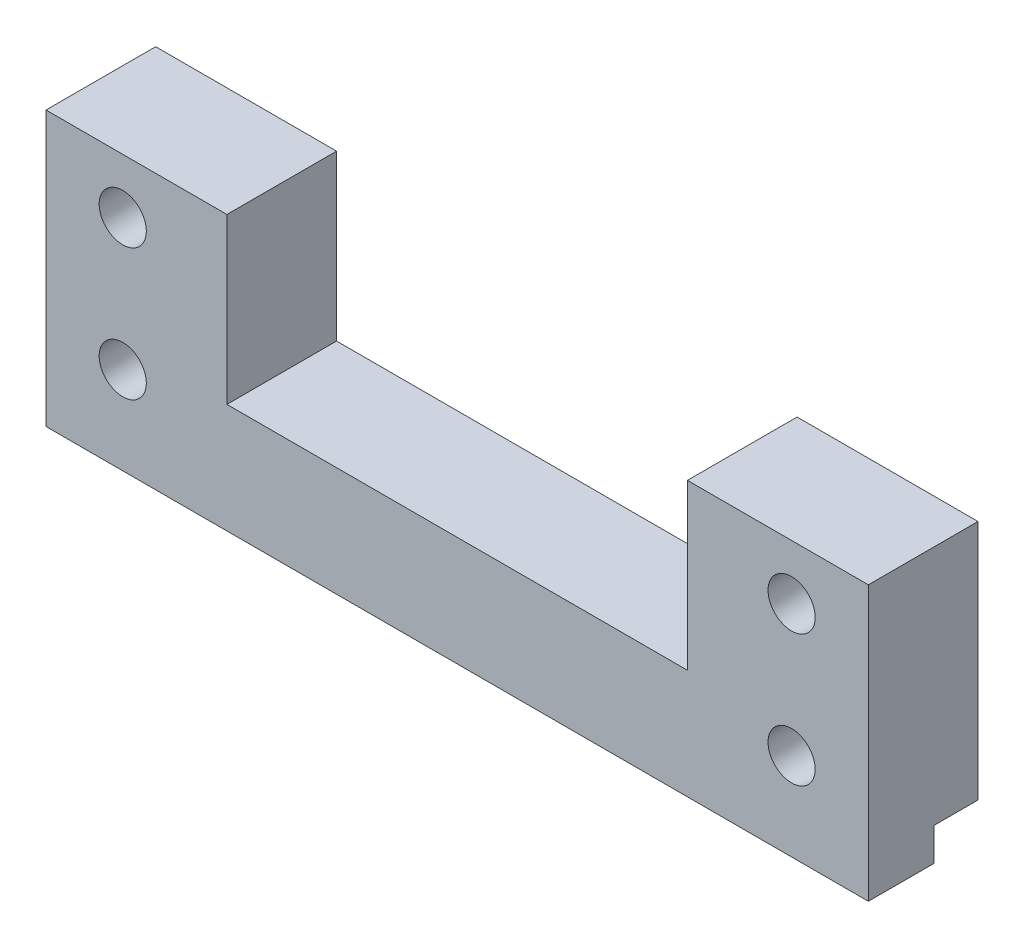
ISO-10303-21;
HEADER;
FILE_DESCRIPTION(('STEP AP214'),'2;1');
FILE_NAME('part.step','',(''),(''),'','','');
FILE_SCHEMA(('AUTOMOTIVE_DESIGN { 1 0 10303 214 1 1 1 1 }'));
ENDSEC;
DATA;
#1=APPLICATION_CONTEXT('core data for automotive mechanical design processes');
#2=APPLICATION_PROTOCOL_DEFINITION('international standard','automotive_design',2000,#1);
#3=PRODUCT_CONTEXT('',#1,'mechanical');
#4=PRODUCT('Part','Part','',(#3));
#5=PRODUCT_RELATED_PRODUCT_CATEGORY('part','',(#4));
#6=PRODUCT_DEFINITION_FORMATION('','',#4);
#7=PRODUCT_DEFINITION_CONTEXT('part definition',#1,'design');
#8=PRODUCT_DEFINITION('design','',#6,#7);
#9=PRODUCT_DEFINITION_SHAPE('','',#8);
#10=(LENGTH_UNIT() NAMED_UNIT(*) SI_UNIT(.MILLI.,.METRE.));
#11=(NAMED_UNIT(*) PLANE_ANGLE_UNIT() SI_UNIT($,.RADIAN.));
#12=(NAMED_UNIT(*) SI_UNIT($,.STERADIAN.) SOLID_ANGLE_UNIT());
#13=UNCERTAINTY_MEASURE_WITH_UNIT(LENGTH_MEASURE(1.E-05),#10,'distance_accuracy_value','');
#14=(GEOMETRIC_REPRESENTATION_CONTEXT(3) GLOBAL_UNCERTAINTY_ASSIGNED_CONTEXT((#13)) GLOBAL_UNIT_ASSIGNED_CONTEXT((#10,
#11,#12)) REPRESENTATION_CONTEXT('',''));
#15=CARTESIAN_POINT('',(0.,0.,0.));
#16=DIRECTION('',(0.,0.,1.));
#17=DIRECTION('',(1.,0.,0.));
#18=AXIS2_PLACEMENT_3D('',#15,#16,#17);
#19=CARTESIAN_POINT('',(0.,0.,10.));
#20=DIRECTION('',(0.,0.,1.));
#21=DIRECTION('',(1.,0.,0.));
#22=AXIS2_PLACEMENT_3D('',#19,#20,#21);
#23=PLANE('',#22);
#24=CARTESIAN_POINT('',(30.5,0.,10.));
#25=DIRECTION('',(0.,0.,1.));
#26=DIRECTION('',(1.,0.,0.));
#27=AXIS2_PLACEMENT_3D('',#24,#25,#26);
#28=CIRCLE('',#27,2.15);
#29=CARTESIAN_POINT('',(32.65,0.,10.));
#30=VERTEX_POINT('',#29);
#31=EDGE_CURVE('E198',#30,#30,#28,.T.);
#32=ORIENTED_EDGE('',*,*,#31,.F.);
#33=EDGE_LOOP('',(#32));
#34=FACE_BOUND('',#33,.T.);
#35=CARTESIAN_POINT('',(-30.5,0.,10.));
#36=DIRECTION('',(0.,0.,1.));
#37=DIRECTION('',(1.,0.,0.));
#38=AXIS2_PLACEMENT_3D('',#35,#36,#37);
#39=CIRCLE('',#38,2.15);
#40=CARTESIAN_POINT('',(-28.35,0.,10.));
#41=VERTEX_POINT('',#40);
#42=EDGE_CURVE('E140',#41,#41,#39,.T.);
#43=ORIENTED_EDGE('',*,*,#42,.F.);
#44=EDGE_LOOP('',(#43));
#45=FACE_BOUND('',#44,.T.);
#46=DIRECTION('',(0.,-1.,0.));
#47=VECTOR('',#46,1.);
#48=CARTESIAN_POINT('',(-37.5,4.99999999999999,10.));
#49=LINE('',#48,#47);
#50=CARTESIAN_POINT('',(-37.5,4.99999999999999,10.));
#51=VERTEX_POINT('',#50);
#52=CARTESIAN_POINT('',(-37.5,-20.,10.));
#53=VERTEX_POINT('',#52);
#54=EDGE_CURVE('E150',#51,#53,#49,.T.);
#55=ORIENTED_EDGE('',*,*,#54,.T.);
#56=DIRECTION('',(1.,0.,0.));
#57=VECTOR('',#56,1.);
#58=CARTESIAN_POINT('',(-37.5,-20.,10.));
#59=LINE('',#58,#57);
#60=CARTESIAN_POINT('',(37.5,-20.,10.));
#61=VERTEX_POINT('',#60);
#62=EDGE_CURVE('E92',#53,#61,#59,.T.);
#63=ORIENTED_EDGE('',*,*,#62,.T.);
#64=DIRECTION('',(0.,1.,0.));
#65=VECTOR('',#64,1.);
#66=CARTESIAN_POINT('',(37.5,4.99999999999999,10.));
#67=LINE('',#66,#65);
#68=CARTESIAN_POINT('',(37.5,4.99999999999999,10.));
#69=VERTEX_POINT('',#68);
#70=EDGE_CURVE('E168',#61,#69,#67,.T.);
#71=ORIENTED_EDGE('',*,*,#70,.T.);
#72=DIRECTION('',(-1.,0.,0.));
#73=VECTOR('',#72,1.);
#74=CARTESIAN_POINT('',(21.,4.99999999999999,10.));
#75=LINE('',#74,#73);
#76=CARTESIAN_POINT('',(21.,4.99999999999999,10.));
#77=VERTEX_POINT('',#76);
#78=EDGE_CURVE('E217',#69,#77,#75,.T.);
#79=ORIENTED_EDGE('',*,*,#78,.T.);
#80=DIRECTION('',(0.,-1.,0.));
#81=VECTOR('',#80,1.);
#82=CARTESIAN_POINT('',(21.,4.99999999999999,10.));
#83=LINE('',#82,#81);
#84=CARTESIAN_POINT('',(21.,-10.,10.));
#85=VERTEX_POINT('',#84);
#86=EDGE_CURVE('E115',#77,#85,#83,.T.);
#87=ORIENTED_EDGE('',*,*,#86,.T.);
#88=DIRECTION('',(-1.,0.,0.));
#89=VECTOR('',#88,1.);
#90=CARTESIAN_POINT('',(-21.,-10.,10.));
#91=LINE('',#90,#89);
#92=CARTESIAN_POINT('',(-21.,-10.,10.));
#93=VERTEX_POINT('',#92);
#94=EDGE_CURVE('E108',#85,#93,#91,.T.);
#95=ORIENTED_EDGE('',*,*,#94,.T.);
#96=DIRECTION('',(0.,1.,0.));
#97=VECTOR('',#96,1.);
#98=CARTESIAN_POINT('',(-21.,4.99999999999999,10.));
#99=LINE('',#98,#97);
#100=CARTESIAN_POINT('',(-21.,4.99999999999999,10.));
#101=VERTEX_POINT('',#100);
#102=EDGE_CURVE('E112',#93,#101,#99,.T.);
#103=ORIENTED_EDGE('',*,*,#102,.T.);
#104=DIRECTION('',(-1.,0.,0.));
#105=VECTOR('',#104,1.);
#106=CARTESIAN_POINT('',(-37.5,4.99999999999999,10.));
#107=LINE('',#106,#105);
#108=EDGE_CURVE('E57',#101,#51,#107,.T.);
#109=ORIENTED_EDGE('',*,*,#108,.T.);
#110=EDGE_LOOP('',(#55,#63,#71,#79,#87,#95,#103,#109));
#111=FACE_BOUND('',#110,.T.);
#112=CARTESIAN_POINT('',(-30.5,-12.,10.));
#113=DIRECTION('',(0.,0.,1.));
#114=DIRECTION('',(1.,0.,0.));
#115=AXIS2_PLACEMENT_3D('',#112,#113,#114);
#116=CIRCLE('',#115,2.15);
#117=CARTESIAN_POINT('',(-28.35,-12.,10.));
#118=VERTEX_POINT('',#117);
#119=EDGE_CURVE('E204',#118,#118,#116,.T.);
#120=ORIENTED_EDGE('',*,*,#119,.F.);
#121=EDGE_LOOP('',(#120));
#122=FACE_BOUND('',#121,.T.);
#123=CARTESIAN_POINT('',(30.5,-12.,10.));
#124=DIRECTION('',(0.,0.,1.));
#125=DIRECTION('',(1.,0.,0.));
#126=AXIS2_PLACEMENT_3D('',#123,#124,#125);
#127=CIRCLE('',#126,2.15);
#128=CARTESIAN_POINT('',(32.65,-12.,10.));
#129=VERTEX_POINT('',#128);
#130=EDGE_CURVE('E192',#129,#129,#127,.T.);
#131=ORIENTED_EDGE('',*,*,#130,.F.);
#132=EDGE_LOOP('',(#131));
#133=FACE_BOUND('',#132,.T.);
#134=ADVANCED_FACE('F33',(#34,#45,#111,#122,#133),#23,.T.);
#135=CARTESIAN_POINT('',(0.,0.,0.));
#136=DIRECTION('',(0.,0.,1.));
#137=DIRECTION('',(1.,0.,0.));
#138=AXIS2_PLACEMENT_3D('',#135,#136,#137);
#139=PLANE('',#138);
#140=CARTESIAN_POINT('',(30.5,0.,0.));
#141=DIRECTION('',(0.,0.,1.));
#142=DIRECTION('',(1.,0.,0.));
#143=AXIS2_PLACEMENT_3D('',#140,#141,#142);
#144=CIRCLE('',#143,2.15);
#145=CARTESIAN_POINT('',(32.65,0.,0.));
#146=VERTEX_POINT('',#145);
#147=EDGE_CURVE('E195',#146,#146,#144,.T.);
#148=ORIENTED_EDGE('',*,*,#147,.T.);
#149=EDGE_LOOP('',(#148));
#150=FACE_BOUND('',#149,.T.);
#151=CARTESIAN_POINT('',(-30.5,0.,0.));
#152=DIRECTION('',(0.,0.,1.));
#153=DIRECTION('',(1.,0.,0.));
#154=AXIS2_PLACEMENT_3D('',#151,#152,#153);
#155=CIRCLE('',#154,2.15);
#156=CARTESIAN_POINT('',(-28.35,0.,0.));
#157=VERTEX_POINT('',#156);
#158=EDGE_CURVE('E207',#157,#157,#155,.T.);
#159=ORIENTED_EDGE('',*,*,#158,.T.);
#160=EDGE_LOOP('',(#159));
#161=FACE_BOUND('',#160,.T.);
#162=DIRECTION('',(0.,1.,0.));
#163=VECTOR('',#162,1.);
#164=CARTESIAN_POINT('',(37.5,4.99999999999999,0.));
#165=LINE('',#164,#163);
#166=CARTESIAN_POINT('',(37.5,-17.,0.));
#167=VERTEX_POINT('',#166);
#168=CARTESIAN_POINT('',(37.5,4.99999999999999,0.));
#169=VERTEX_POINT('',#168);
#170=EDGE_CURVE('E139',#167,#169,#165,.T.);
#171=ORIENTED_EDGE('',*,*,#170,.F.);
#172=DIRECTION('',(1.,0.,0.));
#173=VECTOR('',#172,1.);
#174=CARTESIAN_POINT('',(37.5,-17.,0.));
#175=LINE('',#174,#173);
#176=CARTESIAN_POINT('',(-37.5,-17.,0.));
#177=VERTEX_POINT('',#176);
#178=EDGE_CURVE('E180',#177,#167,#175,.T.);
#179=ORIENTED_EDGE('',*,*,#178,.F.);
#180=DIRECTION('',(0.,-1.,0.));
#181=VECTOR('',#180,1.);
#182=CARTESIAN_POINT('',(-37.5,4.99999999999999,0.));
#183=LINE('',#182,#181);
#184=CARTESIAN_POINT('',(-37.5,4.99999999999999,0.));
#185=VERTEX_POINT('',#184);
#186=EDGE_CURVE('E136',#185,#177,#183,.T.);
#187=ORIENTED_EDGE('',*,*,#186,.F.);
#188=DIRECTION('',(-1.,0.,0.));
#189=VECTOR('',#188,1.);
#190=CARTESIAN_POINT('',(-37.5,4.99999999999999,0.));
#191=LINE('',#190,#189);
#192=CARTESIAN_POINT('',(-21.,4.99999999999999,0.));
#193=VERTEX_POINT('',#192);
#194=EDGE_CURVE('E84',#193,#185,#191,.T.);
#195=ORIENTED_EDGE('',*,*,#194,.F.);
#196=DIRECTION('',(0.,1.,0.));
#197=VECTOR('',#196,1.);
#198=CARTESIAN_POINT('',(-21.,4.99999999999999,0.));
#199=LINE('',#198,#197);
#200=CARTESIAN_POINT('',(-21.,-10.,0.));
#201=VERTEX_POINT('',#200);
#202=EDGE_CURVE('E147',#201,#193,#199,.T.);
#203=ORIENTED_EDGE('',*,*,#202,.F.);
#204=DIRECTION('',(-1.,0.,0.));
#205=VECTOR('',#204,1.);
#206=CARTESIAN_POINT('',(-21.,-10.,0.));
#207=LINE('',#206,#205);
#208=CARTESIAN_POINT('',(21.,-10.,0.));
#209=VERTEX_POINT('',#208);
#210=EDGE_CURVE('E124',#209,#201,#207,.T.);
#211=ORIENTED_EDGE('',*,*,#210,.F.);
#212=DIRECTION('',(0.,-1.,0.));
#213=VECTOR('',#212,1.);
#214=CARTESIAN_POINT('',(21.,4.99999999999999,0.));
#215=LINE('',#214,#213);
#216=CARTESIAN_POINT('',(21.,4.99999999999999,0.));
#217=VERTEX_POINT('',#216);
#218=EDGE_CURVE('E144',#217,#209,#215,.T.);
#219=ORIENTED_EDGE('',*,*,#218,.F.);
#220=DIRECTION('',(-1.,0.,0.));
#221=VECTOR('',#220,1.);
#222=CARTESIAN_POINT('',(21.,4.99999999999999,0.));
#223=LINE('',#222,#221);
#224=EDGE_CURVE('E142',#169,#217,#223,.T.);
#225=ORIENTED_EDGE('',*,*,#224,.F.);
#226=EDGE_LOOP('',(#171,#179,#187,#195,#203,#211,#219,#225));
#227=FACE_BOUND('',#226,.T.);
#228=CARTESIAN_POINT('',(-30.5,-12.,0.));
#229=DIRECTION('',(0.,0.,1.));
#230=DIRECTION('',(1.,0.,0.));
#231=AXIS2_PLACEMENT_3D('',#228,#229,#230);
#232=CIRCLE('',#231,2.15);
#233=CARTESIAN_POINT('',(-28.35,-12.,0.));
#234=VERTEX_POINT('',#233);
#235=EDGE_CURVE('E201',#234,#234,#232,.T.);
#236=ORIENTED_EDGE('',*,*,#235,.T.);
#237=EDGE_LOOP('',(#236));
#238=FACE_BOUND('',#237,.T.);
#239=CARTESIAN_POINT('',(30.5,-12.,0.));
#240=DIRECTION('',(0.,0.,1.));
#241=DIRECTION('',(1.,0.,0.));
#242=AXIS2_PLACEMENT_3D('',#239,#240,#241);
#243=CIRCLE('',#242,2.15);
#244=CARTESIAN_POINT('',(32.65,-12.,0.));
#245=VERTEX_POINT('',#244);
#246=EDGE_CURVE('E189',#245,#245,#243,.T.);
#247=ORIENTED_EDGE('',*,*,#246,.T.);
#248=EDGE_LOOP('',(#247));
#249=FACE_BOUND('',#248,.T.);
#250=ADVANCED_FACE('F228',(#150,#161,#227,#238,#249),#139,.F.);
#251=CARTESIAN_POINT('',(-37.5,4.99999999999999,10.));
#252=DIRECTION('',(1.,0.,0.));
#253=DIRECTION('',(0.,0.,-1.));
#254=AXIS2_PLACEMENT_3D('',#251,#252,#253);
#255=PLANE('',#254);
#256=ORIENTED_EDGE('',*,*,#186,.T.);
#257=DIRECTION('',(0.,0.,-1.));
#258=VECTOR('',#257,1.);
#259=CARTESIAN_POINT('',(-37.5,-17.,4.));
#260=LINE('',#259,#258);
#261=CARTESIAN_POINT('',(-37.5,-17.,4.));
#262=VERTEX_POINT('',#261);
#263=EDGE_CURVE('E184',#262,#177,#260,.T.);
#264=ORIENTED_EDGE('',*,*,#263,.F.);
#265=DIRECTION('',(0.,1.,0.));
#266=VECTOR('',#265,1.);
#267=CARTESIAN_POINT('',(-37.5,-20.,4.));
#268=LINE('',#267,#266);
#269=CARTESIAN_POINT('',(-37.5,-20.,4.));
#270=VERTEX_POINT('',#269);
#271=EDGE_CURVE('E177',#270,#262,#268,.T.);
#272=ORIENTED_EDGE('',*,*,#271,.F.);
#273=DIRECTION('',(0.,0.,-1.));
#274=VECTOR('',#273,1.);
#275=CARTESIAN_POINT('',(-37.5,-20.,10.));
#276=LINE('',#275,#274);
#277=EDGE_CURVE('E11',#53,#270,#276,.T.);
#278=ORIENTED_EDGE('',*,*,#277,.F.);
#279=ORIENTED_EDGE('',*,*,#54,.F.);
#280=DIRECTION('',(0.,0.,-1.));
#281=VECTOR('',#280,1.);
#282=CARTESIAN_POINT('',(-37.5,4.99999999999999,10.));
#283=LINE('',#282,#281);
#284=EDGE_CURVE('E132',#51,#185,#283,.T.);
#285=ORIENTED_EDGE('',*,*,#284,.T.);
#286=EDGE_LOOP('',(#256,#264,#272,#278,#279,#285));
#287=FACE_BOUND('',#286,.T.);
#288=ADVANCED_FACE('F35',(#287),#255,.F.);
#289=CARTESIAN_POINT('',(-37.5,-20.,10.));
#290=DIRECTION('',(0.,1.,0.));
#291=DIRECTION('',(0.,0.,1.));
#292=AXIS2_PLACEMENT_3D('',#289,#290,#291);
#293=PLANE('',#292);
#294=ORIENTED_EDGE('',*,*,#277,.T.);
#295=DIRECTION('',(-1.,0.,0.));
#296=VECTOR('',#295,1.);
#297=CARTESIAN_POINT('',(37.5,-20.,4.));
#298=LINE('',#297,#296);
#299=CARTESIAN_POINT('',(37.5,-20.,4.));
#300=VERTEX_POINT('',#299);
#301=EDGE_CURVE('E174',#300,#270,#298,.T.);
#302=ORIENTED_EDGE('',*,*,#301,.F.);
#303=DIRECTION('',(0.,0.,-1.));
#304=VECTOR('',#303,1.);
#305=CARTESIAN_POINT('',(37.5,-20.,10.));
#306=LINE('',#305,#304);
#307=EDGE_CURVE('E41',#61,#300,#306,.T.);
#308=ORIENTED_EDGE('',*,*,#307,.F.);
#309=ORIENTED_EDGE('',*,*,#62,.F.);
#310=EDGE_LOOP('',(#294,#302,#308,#309));
#311=FACE_BOUND('',#310,.T.);
#312=ADVANCED_FACE('F172',(#311),#293,.F.);
#313=CARTESIAN_POINT('',(37.5,4.99999999999999,10.));
#314=DIRECTION('',(-1.,0.,0.));
#315=DIRECTION('',(0.,0.,1.));
#316=AXIS2_PLACEMENT_3D('',#313,#314,#315);
#317=PLANE('',#316);
#318=DIRECTION('',(0.,-1.,0.));
#319=VECTOR('',#318,1.);
#320=CARTESIAN_POINT('',(37.5,-20.,4.));
#321=LINE('',#320,#319);
#322=CARTESIAN_POINT('',(37.5,-17.,4.));
#323=VERTEX_POINT('',#322);
#324=EDGE_CURVE('E166',#323,#300,#321,.T.);
#325=ORIENTED_EDGE('',*,*,#324,.F.);
#326=DIRECTION('',(0.,0.,-1.));
#327=VECTOR('',#326,1.);
#328=CARTESIAN_POINT('',(37.5,-17.,4.));
#329=LINE('',#328,#327);
#330=EDGE_CURVE('E187',#323,#167,#329,.T.);
#331=ORIENTED_EDGE('',*,*,#330,.T.);
#332=ORIENTED_EDGE('',*,*,#170,.T.);
#333=DIRECTION('',(0.,0.,-1.));
#334=VECTOR('',#333,1.);
#335=CARTESIAN_POINT('',(37.5,4.99999999999999,10.));
#336=LINE('',#335,#334);
#337=EDGE_CURVE('E157',#69,#169,#336,.T.);
#338=ORIENTED_EDGE('',*,*,#337,.F.);
#339=ORIENTED_EDGE('',*,*,#70,.F.);
#340=ORIENTED_EDGE('',*,*,#307,.T.);
#341=EDGE_LOOP('',(#325,#331,#332,#338,#339,#340));
#342=FACE_BOUND('',#341,.T.);
#343=ADVANCED_FACE('F164',(#342),#317,.F.);
#344=CARTESIAN_POINT('',(21.,4.99999999999999,10.));
#345=DIRECTION('',(0.,-1.,0.));
#346=DIRECTION('',(0.,0.,-1.));
#347=AXIS2_PLACEMENT_3D('',#344,#345,#346);
#348=PLANE('',#347);
#349=ORIENTED_EDGE('',*,*,#224,.T.);
#350=DIRECTION('',(0.,0.,-1.));
#351=VECTOR('',#350,1.);
#352=CARTESIAN_POINT('',(21.,4.99999999999999,10.));
#353=LINE('',#352,#351);
#354=EDGE_CURVE('E154',#77,#217,#353,.T.);
#355=ORIENTED_EDGE('',*,*,#354,.F.);
#356=ORIENTED_EDGE('',*,*,#78,.F.);
#357=ORIENTED_EDGE('',*,*,#337,.T.);
#358=EDGE_LOOP('',(#349,#355,#356,#357));
#359=FACE_BOUND('',#358,.T.);
#360=ADVANCED_FACE('F221',(#359),#348,.F.);
#361=CARTESIAN_POINT('',(21.,4.99999999999999,10.));
#362=DIRECTION('',(1.,0.,0.));
#363=DIRECTION('',(0.,1.,0.));
#364=AXIS2_PLACEMENT_3D('',#361,#362,#363);
#365=PLANE('',#364);
#366=ORIENTED_EDGE('',*,*,#218,.T.);
#367=DIRECTION('',(0.,0.,-1.));
#368=VECTOR('',#367,1.);
#369=CARTESIAN_POINT('',(21.,-10.,10.));
#370=LINE('',#369,#368);
#371=EDGE_CURVE('E127',#85,#209,#370,.T.);
#372=ORIENTED_EDGE('',*,*,#371,.F.);
#373=ORIENTED_EDGE('',*,*,#86,.F.);
#374=ORIENTED_EDGE('',*,*,#354,.T.);
#375=EDGE_LOOP('',(#366,#372,#373,#374));
#376=FACE_BOUND('',#375,.T.);
#377=ADVANCED_FACE('F225',(#376),#365,.F.);
#378=CARTESIAN_POINT('',(-21.,-10.,10.));
#379=DIRECTION('',(0.,-1.,0.));
#380=DIRECTION('',(0.,0.,-1.));
#381=AXIS2_PLACEMENT_3D('',#378,#379,#380);
#382=PLANE('',#381);
#383=ORIENTED_EDGE('',*,*,#210,.T.);
#384=DIRECTION('',(0.,0.,-1.));
#385=VECTOR('',#384,1.);
#386=CARTESIAN_POINT('',(-21.,-10.,10.));
#387=LINE('',#386,#385);
#388=EDGE_CURVE('E121',#93,#201,#387,.T.);
#389=ORIENTED_EDGE('',*,*,#388,.F.);
#390=ORIENTED_EDGE('',*,*,#94,.F.);
#391=ORIENTED_EDGE('',*,*,#371,.T.);
#392=EDGE_LOOP('',(#383,#389,#390,#391));
#393=FACE_BOUND('',#392,.T.);
#394=ADVANCED_FACE('F122',(#393),#382,.F.);
#395=CARTESIAN_POINT('',(-21.,4.99999999999999,10.));
#396=DIRECTION('',(-1.,0.,0.));
#397=DIRECTION('',(0.,-1.,0.));
#398=AXIS2_PLACEMENT_3D('',#395,#396,#397);
#399=PLANE('',#398);
#400=ORIENTED_EDGE('',*,*,#202,.T.);
#401=DIRECTION('',(0.,0.,-1.));
#402=VECTOR('',#401,1.);
#403=CARTESIAN_POINT('',(-21.,4.99999999999999,10.));
#404=LINE('',#403,#402);
#405=EDGE_CURVE('E128',#101,#193,#404,.T.);
#406=ORIENTED_EDGE('',*,*,#405,.F.);
#407=ORIENTED_EDGE('',*,*,#102,.F.);
#408=ORIENTED_EDGE('',*,*,#388,.T.);
#409=EDGE_LOOP('',(#400,#406,#407,#408));
#410=FACE_BOUND('',#409,.T.);
#411=ADVANCED_FACE('F130',(#410),#399,.F.);
#412=CARTESIAN_POINT('',(-37.5,4.99999999999999,10.));
#413=DIRECTION('',(0.,-1.,0.));
#414=DIRECTION('',(0.,0.,-1.));
#415=AXIS2_PLACEMENT_3D('',#412,#413,#414);
#416=PLANE('',#415);
#417=ORIENTED_EDGE('',*,*,#194,.T.);
#418=ORIENTED_EDGE('',*,*,#284,.F.);
#419=ORIENTED_EDGE('',*,*,#108,.F.);
#420=ORIENTED_EDGE('',*,*,#405,.T.);
#421=EDGE_LOOP('',(#417,#418,#419,#420));
#422=FACE_BOUND('',#421,.T.);
#423=ADVANCED_FACE('F231',(#422),#416,.F.);
#424=CARTESIAN_POINT('',(-30.5,0.,10.));
#425=DIRECTION('',(0.,0.,-1.));
#426=DIRECTION('',(-1.,0.,0.));
#427=AXIS2_PLACEMENT_3D('',#424,#425,#426);
#428=CYLINDRICAL_SURFACE('',#427,2.15);
#429=ORIENTED_EDGE('',*,*,#42,.T.);
#430=EDGE_LOOP('',(#429));
#431=FACE_BOUND('',#430,.T.);
#432=ORIENTED_EDGE('',*,*,#158,.F.);
#433=EDGE_LOOP('',(#432));
#434=FACE_BOUND('',#433,.T.);
#435=ADVANCED_FACE('F264',(#431,#434),#428,.F.);
#436=CARTESIAN_POINT('',(-30.5,-12.,10.));
#437=DIRECTION('',(0.,0.,-1.));
#438=DIRECTION('',(-1.,0.,0.));
#439=AXIS2_PLACEMENT_3D('',#436,#437,#438);
#440=CYLINDRICAL_SURFACE('',#439,2.15);
#441=ORIENTED_EDGE('',*,*,#119,.T.);
#442=EDGE_LOOP('',(#441));
#443=FACE_BOUND('',#442,.T.);
#444=ORIENTED_EDGE('',*,*,#235,.F.);
#445=EDGE_LOOP('',(#444));
#446=FACE_BOUND('',#445,.T.);
#447=ADVANCED_FACE('F305',(#443,#446),#440,.F.);
#448=CARTESIAN_POINT('',(30.5,0.,10.));
#449=DIRECTION('',(0.,0.,-1.));
#450=DIRECTION('',(-1.,0.,0.));
#451=AXIS2_PLACEMENT_3D('',#448,#449,#450);
#452=CYLINDRICAL_SURFACE('',#451,2.15);
#453=ORIENTED_EDGE('',*,*,#31,.T.);
#454=EDGE_LOOP('',(#453));
#455=FACE_BOUND('',#454,.T.);
#456=ORIENTED_EDGE('',*,*,#147,.F.);
#457=EDGE_LOOP('',(#456));
#458=FACE_BOUND('',#457,.T.);
#459=ADVANCED_FACE('F250',(#455,#458),#452,.F.);
#460=CARTESIAN_POINT('',(30.5,-12.,10.));
#461=DIRECTION('',(0.,0.,-1.));
#462=DIRECTION('',(-1.,0.,0.));
#463=AXIS2_PLACEMENT_3D('',#460,#461,#462);
#464=CYLINDRICAL_SURFACE('',#463,2.15);
#465=ORIENTED_EDGE('',*,*,#130,.T.);
#466=EDGE_LOOP('',(#465));
#467=FACE_BOUND('',#466,.T.);
#468=ORIENTED_EDGE('',*,*,#246,.F.);
#469=EDGE_LOOP('',(#468));
#470=FACE_BOUND('',#469,.T.);
#471=ADVANCED_FACE('F243',(#467,#470),#464,.F.);
#472=CARTESIAN_POINT('',(37.5,-17.,4.));
#473=DIRECTION('',(0.,1.,0.));
#474=DIRECTION('',(0.,0.,1.));
#475=AXIS2_PLACEMENT_3D('',#472,#473,#474);
#476=PLANE('',#475);
#477=ORIENTED_EDGE('',*,*,#178,.T.);
#478=ORIENTED_EDGE('',*,*,#330,.F.);
#479=DIRECTION('',(1.,0.,0.));
#480=VECTOR('',#479,1.);
#481=CARTESIAN_POINT('',(37.5,-17.,4.));
#482=LINE('',#481,#480);
#483=EDGE_CURVE('E48',#262,#323,#482,.T.);
#484=ORIENTED_EDGE('',*,*,#483,.F.);
#485=ORIENTED_EDGE('',*,*,#263,.T.);
#486=EDGE_LOOP('',(#477,#478,#484,#485));
#487=FACE_BOUND('',#486,.T.);
#488=ADVANCED_FACE('F239',(#487),#476,.F.);
#489=CARTESIAN_POINT('',(0.,0.,4.));
#490=DIRECTION('',(0.,0.,1.));
#491=DIRECTION('',(1.,0.,0.));
#492=AXIS2_PLACEMENT_3D('',#489,#490,#491);
#493=PLANE('',#492);
#494=ORIENTED_EDGE('',*,*,#324,.T.);
#495=ORIENTED_EDGE('',*,*,#301,.T.);
#496=ORIENTED_EDGE('',*,*,#271,.T.);
#497=ORIENTED_EDGE('',*,*,#483,.T.);
#498=EDGE_LOOP('',(#494,#495,#496,#497));
#499=FACE_BOUND('',#498,.T.);
#500=ADVANCED_FACE('F236',(#499),#493,.F.);
#501=CLOSED_SHELL('',(#134,#250,#288,#312,#343,#360,#377,#394,#411,#423,#435,#447,#459,#471,
#488,#500));
#502=MANIFOLD_SOLID_BREP('B2',#501);
#503=ADVANCED_BREP_SHAPE_REPRESENTATION('',(#18,#502),#14);
#504=SHAPE_DEFINITION_REPRESENTATION(#9,#503);
ENDSEC;
END-ISO-10303-21;
